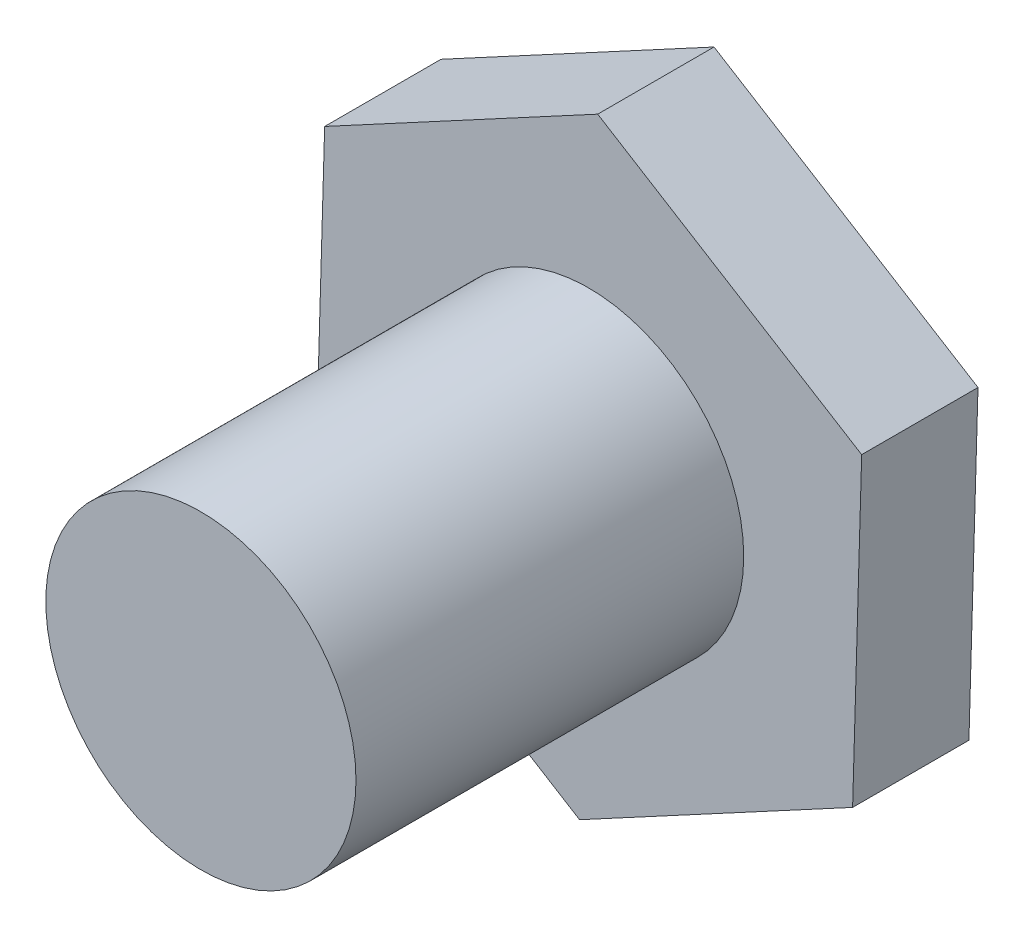
ISO-10303-21;
HEADER;
FILE_DESCRIPTION(('STEP AP214'),'2;1');
FILE_NAME('part.step','',(''),(''),'','','');
FILE_SCHEMA(('AUTOMOTIVE_DESIGN { 1 0 10303 214 1 1 1 1 }'));
ENDSEC;
DATA;
#1=APPLICATION_CONTEXT('core data for automotive mechanical design processes');
#2=APPLICATION_PROTOCOL_DEFINITION('international standard','automotive_design',2000,#1);
#3=PRODUCT_CONTEXT('',#1,'mechanical');
#4=PRODUCT('Part','Part','',(#3));
#5=PRODUCT_RELATED_PRODUCT_CATEGORY('part','',(#4));
#6=PRODUCT_DEFINITION_FORMATION('','',#4);
#7=PRODUCT_DEFINITION_CONTEXT('part definition',#1,'design');
#8=PRODUCT_DEFINITION('design','',#6,#7);
#9=PRODUCT_DEFINITION_SHAPE('','',#8);
#10=(LENGTH_UNIT() NAMED_UNIT(*) SI_UNIT(.MILLI.,.METRE.));
#11=(NAMED_UNIT(*) PLANE_ANGLE_UNIT() SI_UNIT($,.RADIAN.));
#12=(NAMED_UNIT(*) SI_UNIT($,.STERADIAN.) SOLID_ANGLE_UNIT());
#13=UNCERTAINTY_MEASURE_WITH_UNIT(LENGTH_MEASURE(1.E-05),#10,'distance_accuracy_value','');
#14=(GEOMETRIC_REPRESENTATION_CONTEXT(3) GLOBAL_UNCERTAINTY_ASSIGNED_CONTEXT((#13)) GLOBAL_UNIT_ASSIGNED_CONTEXT((#10,
#11,#12)) REPRESENTATION_CONTEXT('',''));
#15=CARTESIAN_POINT('',(0.,0.,0.));
#16=DIRECTION('',(0.,0.,1.));
#17=DIRECTION('',(1.,0.,0.));
#18=AXIS2_PLACEMENT_3D('',#15,#16,#17);
#19=CARTESIAN_POINT('',(-0.116953114143439,-3.99828988057296,1.5));
#20=DIRECTION('',(-0.47446514309664,0.880274291335539,0.));
#21=DIRECTION('',(-0.880274291335539,-0.47446514309664,0.));
#22=AXIS2_PLACEMENT_3D('',#19,#20,#21);
#23=PLANE('',#22);
#24=DIRECTION('',(0.880274291335539,0.47446514309664,0.));
#25=VECTOR('',#24,1.);
#26=CARTESIAN_POINT('',(-0.116953114143439,-3.99828988057296,0.));
#27=LINE('',#26,#25);
#28=CARTESIAN_POINT('',(-0.116953114143439,-3.99828988057296,0.));
#29=VERTEX_POINT('',#28);
#30=CARTESIAN_POINT('',(3.40414405119872,-2.1004293081864,0.));
#31=VERTEX_POINT('',#30);
#32=EDGE_CURVE('E130',#29,#31,#27,.T.);
#33=ORIENTED_EDGE('',*,*,#32,.T.);
#34=DIRECTION('',(0.,0.,-1.));
#35=VECTOR('',#34,1.);
#36=CARTESIAN_POINT('',(3.40414405119872,-2.1004293081864,1.5));
#37=LINE('',#36,#35);
#38=CARTESIAN_POINT('',(3.40414405119872,-2.1004293081864,1.5));
#39=VERTEX_POINT('',#38);
#40=EDGE_CURVE('E42',#39,#31,#37,.T.);
#41=ORIENTED_EDGE('',*,*,#40,.F.);
#42=DIRECTION('',(0.880274291335539,0.47446514309664,0.));
#43=VECTOR('',#42,1.);
#44=CARTESIAN_POINT('',(-0.116953114143439,-3.99828988057296,1.5));
#45=LINE('',#44,#43);
#46=CARTESIAN_POINT('',(-0.116953114143439,-3.99828988057296,1.5));
#47=VERTEX_POINT('',#46);
#48=EDGE_CURVE('E147',#47,#39,#45,.T.);
#49=ORIENTED_EDGE('',*,*,#48,.F.);
#50=DIRECTION('',(0.,0.,-1.));
#51=VECTOR('',#50,1.);
#52=CARTESIAN_POINT('',(-0.116953114143439,-3.99828988057296,1.5));
#53=LINE('',#52,#51);
#54=EDGE_CURVE('E126',#47,#29,#53,.T.);
#55=ORIENTED_EDGE('',*,*,#54,.T.);
#56=EDGE_LOOP('',(#33,#41,#49,#55));
#57=FACE_BOUND('',#56,.T.);
#58=ADVANCED_FACE('F39',(#57),#23,.F.);
#59=CARTESIAN_POINT('',(3.40414405119872,-2.1004293081864,1.5));
#60=DIRECTION('',(-0.99957247014324,0.0292382785358599,0.));
#61=DIRECTION('',(-0.02923827853586,-0.999572470143241,0.));
#62=AXIS2_PLACEMENT_3D('',#59,#60,#61);
#63=PLANE('',#62);
#64=DIRECTION('',(0.02923827853586,0.99957247014324,0.));
#65=VECTOR('',#64,1.);
#66=CARTESIAN_POINT('',(3.40414405119872,-2.1004293081864,0.));
#67=LINE('',#66,#65);
#68=CARTESIAN_POINT('',(3.52109716534216,1.89786057238656,0.));
#69=VERTEX_POINT('',#68);
#70=EDGE_CURVE('E134',#31,#69,#67,.T.);
#71=ORIENTED_EDGE('',*,*,#70,.T.);
#72=DIRECTION('',(0.,0.,-1.));
#73=VECTOR('',#72,1.);
#74=CARTESIAN_POINT('',(3.52109716534216,1.89786057238656,1.5));
#75=LINE('',#74,#73);
#76=CARTESIAN_POINT('',(3.52109716534216,1.89786057238656,1.5));
#77=VERTEX_POINT('',#76);
#78=EDGE_CURVE('E153',#77,#69,#75,.T.);
#79=ORIENTED_EDGE('',*,*,#78,.F.);
#80=DIRECTION('',(0.02923827853586,0.99957247014324,0.));
#81=VECTOR('',#80,1.);
#82=CARTESIAN_POINT('',(3.40414405119872,-2.1004293081864,1.5));
#83=LINE('',#82,#81);
#84=EDGE_CURVE('E95',#39,#77,#83,.T.);
#85=ORIENTED_EDGE('',*,*,#84,.F.);
#86=ORIENTED_EDGE('',*,*,#40,.T.);
#87=EDGE_LOOP('',(#71,#79,#85,#86));
#88=FACE_BOUND('',#87,.T.);
#89=ADVANCED_FACE('F160',(#88),#63,.F.);
#90=CARTESIAN_POINT('',(3.52109716534216,1.89786057238656,1.5));
#91=DIRECTION('',(-0.5251073270466,-0.851036012799679,0.));
#92=DIRECTION('',(0.851036012799679,-0.5251073270466,0.));
#93=AXIS2_PLACEMENT_3D('',#90,#91,#92);
#94=PLANE('',#93);
#95=DIRECTION('',(-0.851036012799679,0.5251073270466,0.));
#96=VECTOR('',#95,1.);
#97=CARTESIAN_POINT('',(3.52109716534216,1.89786057238656,0.));
#98=LINE('',#97,#96);
#99=CARTESIAN_POINT('',(0.116953114143441,3.99828988057296,0.));
#100=VERTEX_POINT('',#99);
#101=EDGE_CURVE('E138',#69,#100,#98,.T.);
#102=ORIENTED_EDGE('',*,*,#101,.T.);
#103=DIRECTION('',(0.,0.,-1.));
#104=VECTOR('',#103,1.);
#105=CARTESIAN_POINT('',(0.116953114143441,3.99828988057296,1.5));
#106=LINE('',#105,#104);
#107=CARTESIAN_POINT('',(0.116953114143441,3.99828988057296,1.5));
#108=VERTEX_POINT('',#107);
#109=EDGE_CURVE('E119',#108,#100,#106,.T.);
#110=ORIENTED_EDGE('',*,*,#109,.F.);
#111=DIRECTION('',(-0.851036012799679,0.5251073270466,0.));
#112=VECTOR('',#111,1.);
#113=CARTESIAN_POINT('',(3.52109716534216,1.89786057238656,1.5));
#114=LINE('',#113,#112);
#115=EDGE_CURVE('E108',#77,#108,#114,.T.);
#116=ORIENTED_EDGE('',*,*,#115,.F.);
#117=ORIENTED_EDGE('',*,*,#78,.T.);
#118=EDGE_LOOP('',(#102,#110,#116,#117));
#119=FACE_BOUND('',#118,.T.);
#120=ADVANCED_FACE('F166',(#119),#94,.F.);
#121=CARTESIAN_POINT('',(0.116953114143441,3.99828988057296,1.5));
#122=DIRECTION('',(0.47446514309664,-0.880274291335539,0.));
#123=DIRECTION('',(0.880274291335539,0.47446514309664,0.));
#124=AXIS2_PLACEMENT_3D('',#121,#122,#123);
#125=PLANE('',#124);
#126=DIRECTION('',(-0.880274291335539,-0.47446514309664,0.));
#127=VECTOR('',#126,1.);
#128=CARTESIAN_POINT('',(0.116953114143441,3.99828988057296,0.));
#129=LINE('',#128,#127);
#130=CARTESIAN_POINT('',(-3.40414405119872,2.1004293081864,0.));
#131=VERTEX_POINT('',#130);
#132=EDGE_CURVE('E117',#100,#131,#129,.T.);
#133=ORIENTED_EDGE('',*,*,#132,.T.);
#134=DIRECTION('',(0.,0.,-1.));
#135=VECTOR('',#134,1.);
#136=CARTESIAN_POINT('',(-3.40414405119872,2.1004293081864,1.5));
#137=LINE('',#136,#135);
#138=CARTESIAN_POINT('',(-3.40414405119872,2.1004293081864,1.5));
#139=VERTEX_POINT('',#138);
#140=EDGE_CURVE('E114',#139,#131,#137,.T.);
#141=ORIENTED_EDGE('',*,*,#140,.F.);
#142=DIRECTION('',(-0.880274291335539,-0.47446514309664,0.));
#143=VECTOR('',#142,1.);
#144=CARTESIAN_POINT('',(0.116953114143441,3.99828988057296,1.5));
#145=LINE('',#144,#143);
#146=EDGE_CURVE('E102',#108,#139,#145,.T.);
#147=ORIENTED_EDGE('',*,*,#146,.F.);
#148=ORIENTED_EDGE('',*,*,#109,.T.);
#149=EDGE_LOOP('',(#133,#141,#147,#148));
#150=FACE_BOUND('',#149,.T.);
#151=ADVANCED_FACE('F115',(#150),#125,.F.);
#152=CARTESIAN_POINT('',(-3.40414405119872,2.1004293081864,1.5));
#153=DIRECTION('',(0.99957247014324,-0.0292382785358601,0.));
#154=DIRECTION('',(0.0292382785358601,0.999572470143241,0.));
#155=AXIS2_PLACEMENT_3D('',#152,#153,#154);
#156=PLANE('',#155);
#157=DIRECTION('',(-0.0292382785358601,-0.999572470143241,0.));
#158=VECTOR('',#157,1.);
#159=CARTESIAN_POINT('',(-3.40414405119872,2.1004293081864,0.));
#160=LINE('',#159,#158);
#161=CARTESIAN_POINT('',(-3.52109716534216,-1.89786057238656,0.));
#162=VERTEX_POINT('',#161);
#163=EDGE_CURVE('E80',#131,#162,#160,.T.);
#164=ORIENTED_EDGE('',*,*,#163,.T.);
#165=DIRECTION('',(0.,0.,-1.));
#166=VECTOR('',#165,1.);
#167=CARTESIAN_POINT('',(-3.52109716534216,-1.89786057238656,1.5));
#168=LINE('',#167,#166);
#169=CARTESIAN_POINT('',(-3.52109716534216,-1.89786057238656,1.5));
#170=VERTEX_POINT('',#169);
#171=EDGE_CURVE('E120',#170,#162,#168,.T.);
#172=ORIENTED_EDGE('',*,*,#171,.F.);
#173=DIRECTION('',(-0.0292382785358601,-0.999572470143241,0.));
#174=VECTOR('',#173,1.);
#175=CARTESIAN_POINT('',(-3.40414405119872,2.1004293081864,1.5));
#176=LINE('',#175,#174);
#177=EDGE_CURVE('E106',#139,#170,#176,.T.);
#178=ORIENTED_EDGE('',*,*,#177,.F.);
#179=ORIENTED_EDGE('',*,*,#140,.T.);
#180=EDGE_LOOP('',(#164,#172,#178,#179));
#181=FACE_BOUND('',#180,.T.);
#182=ADVANCED_FACE('F122',(#181),#156,.F.);
#183=CARTESIAN_POINT('',(-3.52109716534216,-1.89786057238656,1.5));
#184=DIRECTION('',(0.5251073270466,0.851036012799678,0.));
#185=DIRECTION('',(-0.851036012799679,0.525107327046601,0.));
#186=AXIS2_PLACEMENT_3D('',#183,#184,#185);
#187=PLANE('',#186);
#188=DIRECTION('',(0.851036012799679,-0.525107327046601,0.));
#189=VECTOR('',#188,1.);
#190=CARTESIAN_POINT('',(-3.52109716534216,-1.89786057238656,0.));
#191=LINE('',#190,#189);
#192=EDGE_CURVE('E86',#162,#29,#191,.T.);
#193=ORIENTED_EDGE('',*,*,#192,.T.);
#194=ORIENTED_EDGE('',*,*,#54,.F.);
#195=DIRECTION('',(0.851036012799679,-0.525107327046601,0.));
#196=VECTOR('',#195,1.);
#197=CARTESIAN_POINT('',(-3.52109716534216,-1.89786057238656,1.5));
#198=LINE('',#197,#196);
#199=EDGE_CURVE('E57',#170,#47,#198,.T.);
#200=ORIENTED_EDGE('',*,*,#199,.F.);
#201=ORIENTED_EDGE('',*,*,#171,.T.);
#202=EDGE_LOOP('',(#193,#194,#200,#201));
#203=FACE_BOUND('',#202,.T.);
#204=ADVANCED_FACE('F186',(#203),#187,.F.);
#205=CARTESIAN_POINT('',(0.,0.,1.5));
#206=DIRECTION('',(0.,0.,1.));
#207=DIRECTION('',(1.,0.,0.));
#208=AXIS2_PLACEMENT_3D('',#205,#206,#207);
#209=PLANE('',#208);
#210=CARTESIAN_POINT('',(0.,0.,1.5));
#211=DIRECTION('',(0.,0.,1.));
#212=DIRECTION('',(1.,0.,0.));
#213=AXIS2_PLACEMENT_3D('',#210,#211,#212);
#214=CIRCLE('',#213,2.);
#215=CARTESIAN_POINT('',(2.,0.,1.5));
#216=VERTEX_POINT('',#215);
#217=EDGE_CURVE('E11',#216,#216,#214,.T.);
#218=ORIENTED_EDGE('',*,*,#217,.F.);
#219=EDGE_LOOP('',(#218));
#220=FACE_BOUND('',#219,.T.);
#221=ORIENTED_EDGE('',*,*,#48,.T.);
#222=ORIENTED_EDGE('',*,*,#84,.T.);
#223=ORIENTED_EDGE('',*,*,#115,.T.);
#224=ORIENTED_EDGE('',*,*,#146,.T.);
#225=ORIENTED_EDGE('',*,*,#177,.T.);
#226=ORIENTED_EDGE('',*,*,#199,.T.);
#227=EDGE_LOOP('',(#221,#222,#223,#224,#225,#226));
#228=FACE_BOUND('',#227,.T.);
#229=ADVANCED_FACE('F104',(#220,#228),#209,.T.);
#230=CARTESIAN_POINT('',(0.,0.,0.));
#231=DIRECTION('',(0.,0.,1.));
#232=DIRECTION('',(1.,0.,0.));
#233=AXIS2_PLACEMENT_3D('',#230,#231,#232);
#234=PLANE('',#233);
#235=ORIENTED_EDGE('',*,*,#32,.F.);
#236=ORIENTED_EDGE('',*,*,#192,.F.);
#237=ORIENTED_EDGE('',*,*,#163,.F.);
#238=ORIENTED_EDGE('',*,*,#132,.F.);
#239=ORIENTED_EDGE('',*,*,#101,.F.);
#240=ORIENTED_EDGE('',*,*,#70,.F.);
#241=EDGE_LOOP('',(#235,#236,#237,#238,#239,#240));
#242=FACE_BOUND('',#241,.T.);
#243=ADVANCED_FACE('F165',(#242),#234,.F.);
#244=CARTESIAN_POINT('',(0.,0.,6.5));
#245=DIRECTION('',(0.,0.,-1.));
#246=DIRECTION('',(-1.,0.,0.));
#247=AXIS2_PLACEMENT_3D('',#244,#245,#246);
#248=CYLINDRICAL_SURFACE('',#247,2.);
#249=CARTESIAN_POINT('',(0.,0.,6.5));
#250=DIRECTION('',(0.,0.,1.));
#251=DIRECTION('',(1.,0.,0.));
#252=AXIS2_PLACEMENT_3D('',#249,#250,#251);
#253=CIRCLE('',#252,2.);
#254=CARTESIAN_POINT('',(2.,0.,6.5));
#255=VERTEX_POINT('',#254);
#256=EDGE_CURVE('E135',#255,#255,#253,.T.);
#257=ORIENTED_EDGE('',*,*,#256,.F.);
#258=EDGE_LOOP('',(#257));
#259=FACE_BOUND('',#258,.T.);
#260=ORIENTED_EDGE('',*,*,#217,.T.);
#261=EDGE_LOOP('',(#260));
#262=FACE_BOUND('',#261,.T.);
#263=ADVANCED_FACE('F179',(#259,#262),#248,.T.);
#264=CARTESIAN_POINT('',(0.,0.,6.5));
#265=DIRECTION('',(0.,0.,1.));
#266=DIRECTION('',(1.,0.,0.));
#267=AXIS2_PLACEMENT_3D('',#264,#265,#266);
#268=PLANE('',#267);
#269=ORIENTED_EDGE('',*,*,#256,.T.);
#270=EDGE_LOOP('',(#269));
#271=FACE_BOUND('',#270,.T.);
#272=ADVANCED_FACE('F177',(#271),#268,.T.);
#273=CLOSED_SHELL('',(#58,#89,#120,#151,#182,#204,#229,#243,#263,#272));
#274=MANIFOLD_SOLID_BREP('B2',#273);
#275=ADVANCED_BREP_SHAPE_REPRESENTATION('',(#18,#274),#14);
#276=SHAPE_DEFINITION_REPRESENTATION(#9,#275);
ENDSEC;
END-ISO-10303-21;
